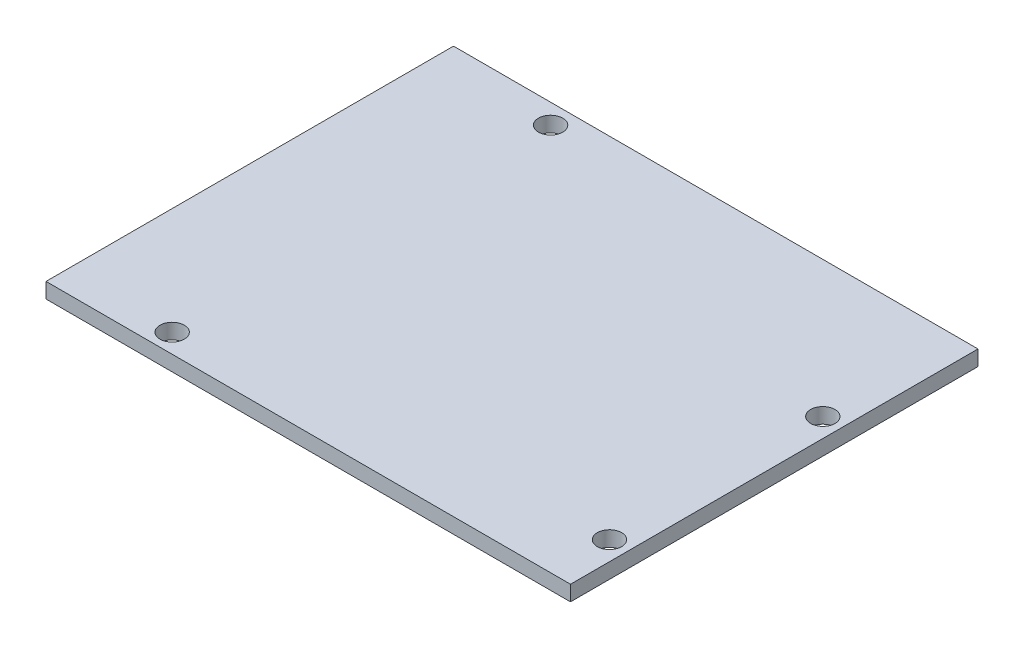
ISO-10303-21;
HEADER;
FILE_DESCRIPTION(('STEP AP214'),'2;1');
FILE_NAME('part.step','',(''),(''),'','','');
FILE_SCHEMA(('AUTOMOTIVE_DESIGN { 1 0 10303 214 1 1 1 1 }'));
ENDSEC;
DATA;
#1=APPLICATION_CONTEXT('core data for automotive mechanical design processes');
#2=APPLICATION_PROTOCOL_DEFINITION('international standard','automotive_design',2000,#1);
#3=PRODUCT_CONTEXT('',#1,'mechanical');
#4=PRODUCT('Part','Part','',(#3));
#5=PRODUCT_RELATED_PRODUCT_CATEGORY('part','',(#4));
#6=PRODUCT_DEFINITION_FORMATION('','',#4);
#7=PRODUCT_DEFINITION_CONTEXT('part definition',#1,'design');
#8=PRODUCT_DEFINITION('design','',#6,#7);
#9=PRODUCT_DEFINITION_SHAPE('','',#8);
#10=(LENGTH_UNIT() NAMED_UNIT(*) SI_UNIT(.MILLI.,.METRE.));
#11=(NAMED_UNIT(*) PLANE_ANGLE_UNIT() SI_UNIT($,.RADIAN.));
#12=(NAMED_UNIT(*) SI_UNIT($,.STERADIAN.) SOLID_ANGLE_UNIT());
#13=UNCERTAINTY_MEASURE_WITH_UNIT(LENGTH_MEASURE(1.E-05),#10,'distance_accuracy_value','');
#14=(GEOMETRIC_REPRESENTATION_CONTEXT(3) GLOBAL_UNCERTAINTY_ASSIGNED_CONTEXT((#13)) GLOBAL_UNIT_ASSIGNED_CONTEXT((#10,
#11,#12)) REPRESENTATION_CONTEXT('',''));
#15=CARTESIAN_POINT('',(0.,0.,0.));
#16=DIRECTION('',(0.,0.,1.));
#17=DIRECTION('',(1.,0.,0.));
#18=AXIS2_PLACEMENT_3D('',#15,#16,#17);
#19=CARTESIAN_POINT('',(0.,2.,0.));
#20=DIRECTION('',(0.,1.,0.));
#21=DIRECTION('',(0.,0.,1.));
#22=AXIS2_PLACEMENT_3D('',#19,#20,#21);
#23=PLANE('',#22);
#24=CARTESIAN_POINT('',(31.8,2.,-8.85));
#25=DIRECTION('',(0.,1.,0.));
#26=DIRECTION('',(0.,0.,1.));
#27=AXIS2_PLACEMENT_3D('',#24,#25,#26);
#28=CIRCLE('',#27,1.59);
#29=CARTESIAN_POINT('',(31.8,2.,-7.25999999999999));
#30=VERTEX_POINT('',#29);
#31=EDGE_CURVE('E122',#30,#30,#28,.T.);
#32=ORIENTED_EDGE('',*,*,#31,.F.);
#33=EDGE_LOOP('',(#32));
#34=FACE_BOUND('',#33,.T.);
#35=CARTESIAN_POINT('',(-20.3,2.,24.15));
#36=DIRECTION('',(0.,1.,0.));
#37=DIRECTION('',(0.,0.,1.));
#38=AXIS2_PLACEMENT_3D('',#35,#36,#37);
#39=CIRCLE('',#38,1.59);
#40=CARTESIAN_POINT('',(-20.3,2.,25.74));
#41=VERTEX_POINT('',#40);
#42=EDGE_CURVE('E101',#41,#41,#39,.T.);
#43=ORIENTED_EDGE('',*,*,#42,.F.);
#44=EDGE_LOOP('',(#43));
#45=FACE_BOUND('',#44,.T.);
#46=DIRECTION('',(0.,0.,-1.));
#47=VECTOR('',#46,1.);
#48=CARTESIAN_POINT('',(34.3,2.,-26.65));
#49=LINE('',#48,#47);
#50=CARTESIAN_POINT('',(34.3,2.,26.65));
#51=VERTEX_POINT('',#50);
#52=CARTESIAN_POINT('',(34.3,2.,-26.65));
#53=VERTEX_POINT('',#52);
#54=EDGE_CURVE('E86',#51,#53,#49,.T.);
#55=ORIENTED_EDGE('',*,*,#54,.T.);
#56=DIRECTION('',(-1.,0.,0.));
#57=VECTOR('',#56,1.);
#58=CARTESIAN_POINT('',(-34.3,2.,-26.65));
#59=LINE('',#58,#57);
#60=CARTESIAN_POINT('',(-34.3,2.,-26.65));
#61=VERTEX_POINT('',#60);
#62=EDGE_CURVE('E81',#53,#61,#59,.T.);
#63=ORIENTED_EDGE('',*,*,#62,.T.);
#64=DIRECTION('',(0.,0.,1.));
#65=VECTOR('',#64,1.);
#66=CARTESIAN_POINT('',(-34.3,2.,-26.65));
#67=LINE('',#66,#65);
#68=CARTESIAN_POINT('',(-34.3,2.,26.65));
#69=VERTEX_POINT('',#68);
#70=EDGE_CURVE('E84',#61,#69,#67,.T.);
#71=ORIENTED_EDGE('',*,*,#70,.T.);
#72=DIRECTION('',(1.,0.,0.));
#73=VECTOR('',#72,1.);
#74=CARTESIAN_POINT('',(-34.3,2.,26.65));
#75=LINE('',#74,#73);
#76=EDGE_CURVE('E51',#69,#51,#75,.T.);
#77=ORIENTED_EDGE('',*,*,#76,.T.);
#78=EDGE_LOOP('',(#55,#63,#71,#77));
#79=FACE_BOUND('',#78,.T.);
#80=CARTESIAN_POINT('',(-19.,2.,-24.05));
#81=DIRECTION('',(0.,1.,0.));
#82=DIRECTION('',(0.,0.,1.));
#83=AXIS2_PLACEMENT_3D('',#80,#81,#82);
#84=CIRCLE('',#83,1.59);
#85=CARTESIAN_POINT('',(-19.,2.,-22.46));
#86=VERTEX_POINT('',#85);
#87=EDGE_CURVE('E116',#86,#86,#84,.T.);
#88=ORIENTED_EDGE('',*,*,#87,.F.);
#89=EDGE_LOOP('',(#88));
#90=FACE_BOUND('',#89,.T.);
#91=CARTESIAN_POINT('',(31.8,2.,19.05));
#92=DIRECTION('',(0.,1.,0.));
#93=DIRECTION('',(0.,0.,1.));
#94=AXIS2_PLACEMENT_3D('',#91,#92,#93);
#95=CIRCLE('',#94,1.59);
#96=CARTESIAN_POINT('',(31.8,2.,20.64));
#97=VERTEX_POINT('',#96);
#98=EDGE_CURVE('E128',#97,#97,#95,.T.);
#99=ORIENTED_EDGE('',*,*,#98,.F.);
#100=EDGE_LOOP('',(#99));
#101=FACE_BOUND('',#100,.T.);
#102=ADVANCED_FACE('F34',(#34,#45,#79,#90,#101),#23,.T.);
#103=CARTESIAN_POINT('',(0.,0.,0.));
#104=DIRECTION('',(0.,1.,0.));
#105=DIRECTION('',(0.,0.,1.));
#106=AXIS2_PLACEMENT_3D('',#103,#104,#105);
#107=PLANE('',#106);
#108=DIRECTION('',(0.,0.,-1.));
#109=VECTOR('',#108,1.);
#110=CARTESIAN_POINT('',(34.3,0.,-26.65));
#111=LINE('',#110,#109);
#112=CARTESIAN_POINT('',(34.3,0.,26.65));
#113=VERTEX_POINT('',#112);
#114=CARTESIAN_POINT('',(34.3,0.,-26.65));
#115=VERTEX_POINT('',#114);
#116=EDGE_CURVE('E98',#113,#115,#111,.T.);
#117=ORIENTED_EDGE('',*,*,#116,.F.);
#118=DIRECTION('',(1.,0.,0.));
#119=VECTOR('',#118,1.);
#120=CARTESIAN_POINT('',(-34.3,0.,26.65));
#121=LINE('',#120,#119);
#122=CARTESIAN_POINT('',(-34.3,0.,26.65));
#123=VERTEX_POINT('',#122);
#124=EDGE_CURVE('E74',#123,#113,#121,.T.);
#125=ORIENTED_EDGE('',*,*,#124,.F.);
#126=DIRECTION('',(0.,0.,1.));
#127=VECTOR('',#126,1.);
#128=CARTESIAN_POINT('',(-34.3,0.,-26.65));
#129=LINE('',#128,#127);
#130=CARTESIAN_POINT('',(-34.3,0.,-26.65));
#131=VERTEX_POINT('',#130);
#132=EDGE_CURVE('E68',#131,#123,#129,.T.);
#133=ORIENTED_EDGE('',*,*,#132,.F.);
#134=DIRECTION('',(-1.,0.,0.));
#135=VECTOR('',#134,1.);
#136=CARTESIAN_POINT('',(-34.3,0.,-26.65));
#137=LINE('',#136,#135);
#138=EDGE_CURVE('E90',#115,#131,#137,.T.);
#139=ORIENTED_EDGE('',*,*,#138,.F.);
#140=EDGE_LOOP('',(#117,#125,#133,#139));
#141=FACE_BOUND('',#140,.T.);
#142=CARTESIAN_POINT('',(-20.3,0.,24.15));
#143=DIRECTION('',(0.,1.,0.));
#144=DIRECTION('',(0.,0.,1.));
#145=AXIS2_PLACEMENT_3D('',#142,#143,#144);
#146=CIRCLE('',#145,1.59);
#147=CARTESIAN_POINT('',(-20.3,0.,25.74));
#148=VERTEX_POINT('',#147);
#149=EDGE_CURVE('E113',#148,#148,#146,.T.);
#150=ORIENTED_EDGE('',*,*,#149,.T.);
#151=EDGE_LOOP('',(#150));
#152=FACE_BOUND('',#151,.T.);
#153=CARTESIAN_POINT('',(-19.,0.,-24.05));
#154=DIRECTION('',(0.,1.,0.));
#155=DIRECTION('',(0.,0.,1.));
#156=AXIS2_PLACEMENT_3D('',#153,#154,#155);
#157=CIRCLE('',#156,1.59);
#158=CARTESIAN_POINT('',(-19.,0.,-22.46));
#159=VERTEX_POINT('',#158);
#160=EDGE_CURVE('E119',#159,#159,#157,.T.);
#161=ORIENTED_EDGE('',*,*,#160,.T.);
#162=EDGE_LOOP('',(#161));
#163=FACE_BOUND('',#162,.T.);
#164=CARTESIAN_POINT('',(31.8,0.,-8.85));
#165=DIRECTION('',(0.,1.,0.));
#166=DIRECTION('',(0.,0.,1.));
#167=AXIS2_PLACEMENT_3D('',#164,#165,#166);
#168=CIRCLE('',#167,1.59);
#169=CARTESIAN_POINT('',(31.8,0.,-7.25999999999999));
#170=VERTEX_POINT('',#169);
#171=EDGE_CURVE('E125',#170,#170,#168,.T.);
#172=ORIENTED_EDGE('',*,*,#171,.T.);
#173=EDGE_LOOP('',(#172));
#174=FACE_BOUND('',#173,.T.);
#175=CARTESIAN_POINT('',(31.8,0.,19.05));
#176=DIRECTION('',(0.,1.,0.));
#177=DIRECTION('',(0.,0.,1.));
#178=AXIS2_PLACEMENT_3D('',#175,#176,#177);
#179=CIRCLE('',#178,1.59);
#180=CARTESIAN_POINT('',(31.8,0.,20.64));
#181=VERTEX_POINT('',#180);
#182=EDGE_CURVE('E131',#181,#181,#179,.T.);
#183=ORIENTED_EDGE('',*,*,#182,.T.);
#184=EDGE_LOOP('',(#183));
#185=FACE_BOUND('',#184,.T.);
#186=ADVANCED_FACE('F109',(#141,#152,#163,#174,#185),#107,.F.);
#187=CARTESIAN_POINT('',(34.3,2.,-26.65));
#188=DIRECTION('',(-1.,0.,0.));
#189=DIRECTION('',(0.,0.,1.));
#190=AXIS2_PLACEMENT_3D('',#187,#188,#189);
#191=PLANE('',#190);
#192=ORIENTED_EDGE('',*,*,#116,.T.);
#193=DIRECTION('',(0.,-1.,0.));
#194=VECTOR('',#193,1.);
#195=CARTESIAN_POINT('',(34.3,2.,-26.65));
#196=LINE('',#195,#194);
#197=EDGE_CURVE('E11',#53,#115,#196,.T.);
#198=ORIENTED_EDGE('',*,*,#197,.F.);
#199=ORIENTED_EDGE('',*,*,#54,.F.);
#200=DIRECTION('',(0.,-1.,0.));
#201=VECTOR('',#200,1.);
#202=CARTESIAN_POINT('',(34.3,2.,26.65));
#203=LINE('',#202,#201);
#204=EDGE_CURVE('E94',#51,#113,#203,.T.);
#205=ORIENTED_EDGE('',*,*,#204,.T.);
#206=EDGE_LOOP('',(#192,#198,#199,#205));
#207=FACE_BOUND('',#206,.T.);
#208=ADVANCED_FACE('F36',(#207),#191,.F.);
#209=CARTESIAN_POINT('',(-34.3,2.,-26.65));
#210=DIRECTION('',(0.,0.,1.));
#211=DIRECTION('',(1.,0.,0.));
#212=AXIS2_PLACEMENT_3D('',#209,#210,#211);
#213=PLANE('',#212);
#214=ORIENTED_EDGE('',*,*,#138,.T.);
#215=DIRECTION('',(0.,-1.,0.));
#216=VECTOR('',#215,1.);
#217=CARTESIAN_POINT('',(-34.3,2.,-26.65));
#218=LINE('',#217,#216);
#219=EDGE_CURVE('E43',#61,#131,#218,.T.);
#220=ORIENTED_EDGE('',*,*,#219,.F.);
#221=ORIENTED_EDGE('',*,*,#62,.F.);
#222=ORIENTED_EDGE('',*,*,#197,.T.);
#223=EDGE_LOOP('',(#214,#220,#221,#222));
#224=FACE_BOUND('',#223,.T.);
#225=ADVANCED_FACE('F89',(#224),#213,.F.);
#226=CARTESIAN_POINT('',(-34.3,2.,-26.65));
#227=DIRECTION('',(1.,0.,0.));
#228=DIRECTION('',(0.,0.,-1.));
#229=AXIS2_PLACEMENT_3D('',#226,#227,#228);
#230=PLANE('',#229);
#231=ORIENTED_EDGE('',*,*,#132,.T.);
#232=DIRECTION('',(0.,-1.,0.));
#233=VECTOR('',#232,1.);
#234=CARTESIAN_POINT('',(-34.3,2.,26.65));
#235=LINE('',#234,#233);
#236=EDGE_CURVE('E91',#69,#123,#235,.T.);
#237=ORIENTED_EDGE('',*,*,#236,.F.);
#238=ORIENTED_EDGE('',*,*,#70,.F.);
#239=ORIENTED_EDGE('',*,*,#219,.T.);
#240=EDGE_LOOP('',(#231,#237,#238,#239));
#241=FACE_BOUND('',#240,.T.);
#242=ADVANCED_FACE('F92',(#241),#230,.F.);
#243=CARTESIAN_POINT('',(-34.3,2.,26.65));
#244=DIRECTION('',(0.,0.,-1.));
#245=DIRECTION('',(-1.,0.,0.));
#246=AXIS2_PLACEMENT_3D('',#243,#244,#245);
#247=PLANE('',#246);
#248=ORIENTED_EDGE('',*,*,#124,.T.);
#249=ORIENTED_EDGE('',*,*,#204,.F.);
#250=ORIENTED_EDGE('',*,*,#76,.F.);
#251=ORIENTED_EDGE('',*,*,#236,.T.);
#252=EDGE_LOOP('',(#248,#249,#250,#251));
#253=FACE_BOUND('',#252,.T.);
#254=ADVANCED_FACE('F106',(#253),#247,.F.);
#255=CARTESIAN_POINT('',(-20.3,2.,24.15));
#256=DIRECTION('',(0.,-1.,0.));
#257=DIRECTION('',(0.,0.,-1.));
#258=AXIS2_PLACEMENT_3D('',#255,#256,#257);
#259=CYLINDRICAL_SURFACE('',#258,1.59);
#260=ORIENTED_EDGE('',*,*,#42,.T.);
#261=EDGE_LOOP('',(#260));
#262=FACE_BOUND('',#261,.T.);
#263=ORIENTED_EDGE('',*,*,#149,.F.);
#264=EDGE_LOOP('',(#263));
#265=FACE_BOUND('',#264,.T.);
#266=ADVANCED_FACE('F150',(#262,#265),#259,.F.);
#267=CARTESIAN_POINT('',(-19.,2.,-24.05));
#268=DIRECTION('',(0.,-1.,0.));
#269=DIRECTION('',(0.,0.,-1.));
#270=AXIS2_PLACEMENT_3D('',#267,#268,#269);
#271=CYLINDRICAL_SURFACE('',#270,1.59);
#272=ORIENTED_EDGE('',*,*,#87,.T.);
#273=EDGE_LOOP('',(#272));
#274=FACE_BOUND('',#273,.T.);
#275=ORIENTED_EDGE('',*,*,#160,.F.);
#276=EDGE_LOOP('',(#275));
#277=FACE_BOUND('',#276,.T.);
#278=ADVANCED_FACE('F196',(#274,#277),#271,.F.);
#279=CARTESIAN_POINT('',(31.8,2.,-8.85));
#280=DIRECTION('',(0.,-1.,0.));
#281=DIRECTION('',(0.,0.,-1.));
#282=AXIS2_PLACEMENT_3D('',#279,#280,#281);
#283=CYLINDRICAL_SURFACE('',#282,1.59);
#284=ORIENTED_EDGE('',*,*,#31,.T.);
#285=EDGE_LOOP('',(#284));
#286=FACE_BOUND('',#285,.T.);
#287=ORIENTED_EDGE('',*,*,#171,.F.);
#288=EDGE_LOOP('',(#287));
#289=FACE_BOUND('',#288,.T.);
#290=ADVANCED_FACE('F204',(#286,#289),#283,.F.);
#291=CARTESIAN_POINT('',(31.8,2.,19.05));
#292=DIRECTION('',(0.,-1.,0.));
#293=DIRECTION('',(0.,0.,-1.));
#294=AXIS2_PLACEMENT_3D('',#291,#292,#293);
#295=CYLINDRICAL_SURFACE('',#294,1.59);
#296=ORIENTED_EDGE('',*,*,#98,.T.);
#297=EDGE_LOOP('',(#296));
#298=FACE_BOUND('',#297,.T.);
#299=ORIENTED_EDGE('',*,*,#182,.F.);
#300=EDGE_LOOP('',(#299));
#301=FACE_BOUND('',#300,.T.);
#302=ADVANCED_FACE('F137',(#298,#301),#295,.F.);
#303=CLOSED_SHELL('',(#102,#186,#208,#225,#242,#254,#266,#278,#290,#302));
#304=MANIFOLD_SOLID_BREP('B2',#303);
#305=ADVANCED_BREP_SHAPE_REPRESENTATION('',(#18,#304),#14);
#306=SHAPE_DEFINITION_REPRESENTATION(#9,#305);
ENDSEC;
END-ISO-10303-21;
